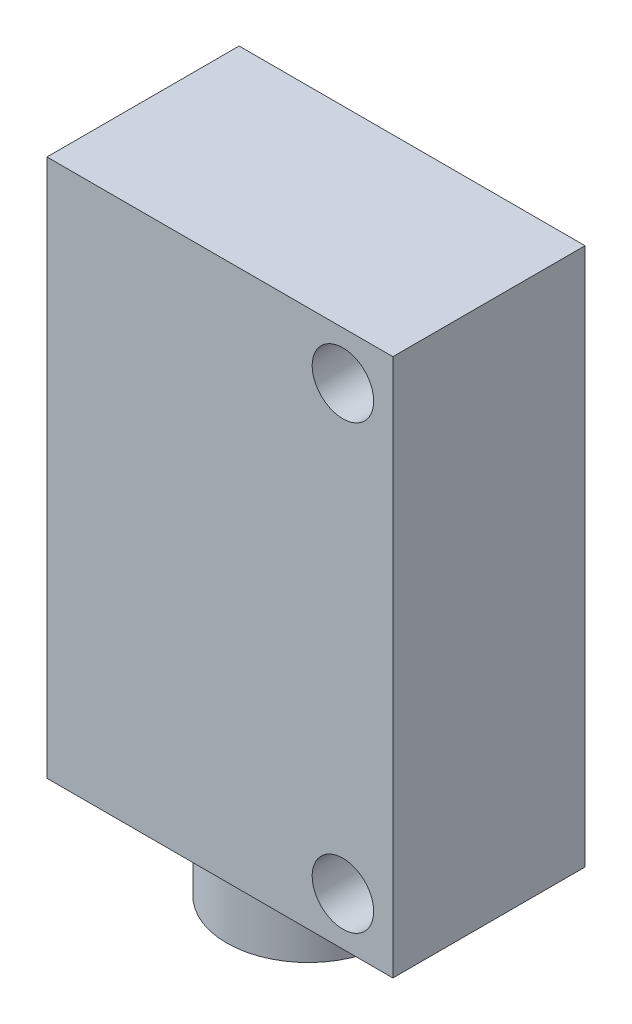
ISO-10303-21;
HEADER;
FILE_DESCRIPTION(('STEP AP214'),'2;1');
FILE_NAME('part.step','',(''),(''),'','','');
FILE_SCHEMA(('AUTOMOTIVE_DESIGN { 1 0 10303 214 1 1 1 1 }'));
ENDSEC;
DATA;
#1=APPLICATION_CONTEXT('core data for automotive mechanical design processes');
#2=APPLICATION_PROTOCOL_DEFINITION('international standard','automotive_design',2000,#1);
#3=PRODUCT_CONTEXT('',#1,'mechanical');
#4=PRODUCT('Part','Part','',(#3));
#5=PRODUCT_RELATED_PRODUCT_CATEGORY('part','',(#4));
#6=PRODUCT_DEFINITION_FORMATION('','',#4);
#7=PRODUCT_DEFINITION_CONTEXT('part definition',#1,'design');
#8=PRODUCT_DEFINITION('design','',#6,#7);
#9=PRODUCT_DEFINITION_SHAPE('','',#8);
#10=(LENGTH_UNIT() NAMED_UNIT(*) SI_UNIT(.MILLI.,.METRE.));
#11=(NAMED_UNIT(*) PLANE_ANGLE_UNIT() SI_UNIT($,.RADIAN.));
#12=(NAMED_UNIT(*) SI_UNIT($,.STERADIAN.) SOLID_ANGLE_UNIT());
#13=UNCERTAINTY_MEASURE_WITH_UNIT(LENGTH_MEASURE(1.E-05),#10,'distance_accuracy_value','');
#14=(GEOMETRIC_REPRESENTATION_CONTEXT(3) GLOBAL_UNCERTAINTY_ASSIGNED_CONTEXT((#13)) GLOBAL_UNIT_ASSIGNED_CONTEXT((#10,
#11,#12)) REPRESENTATION_CONTEXT('',''));
#15=CARTESIAN_POINT('',(0.,0.,0.));
#16=DIRECTION('',(0.,0.,1.));
#17=DIRECTION('',(1.,0.,0.));
#18=AXIS2_PLACEMENT_3D('',#15,#16,#17);
#19=CARTESIAN_POINT('',(0.,0.,10.));
#20=DIRECTION('',(1.,0.,0.));
#21=DIRECTION('',(0.,0.,-1.));
#22=AXIS2_PLACEMENT_3D('',#19,#20,#21);
#23=PLANE('',#22);
#24=DIRECTION('',(0.,-1.,0.));
#25=VECTOR('',#24,1.);
#26=CARTESIAN_POINT('',(0.,0.,0.));
#27=LINE('',#26,#25);
#28=CARTESIAN_POINT('',(0.,28.,0.));
#29=VERTEX_POINT('',#28);
#30=CARTESIAN_POINT('',(0.,0.,0.));
#31=VERTEX_POINT('',#30);
#32=EDGE_CURVE('E137',#29,#31,#27,.T.);
#33=ORIENTED_EDGE('',*,*,#32,.T.);
#34=DIRECTION('',(0.,0.,-1.));
#35=VECTOR('',#34,1.);
#36=CARTESIAN_POINT('',(0.,0.,10.));
#37=LINE('',#36,#35);
#38=CARTESIAN_POINT('',(0.,0.,10.));
#39=VERTEX_POINT('',#38);
#40=EDGE_CURVE('E39',#39,#31,#37,.T.);
#41=ORIENTED_EDGE('',*,*,#40,.F.);
#42=DIRECTION('',(0.,-1.,0.));
#43=VECTOR('',#42,1.);
#44=CARTESIAN_POINT('',(0.,0.,10.));
#45=LINE('',#44,#43);
#46=CARTESIAN_POINT('',(0.,28.,10.));
#47=VERTEX_POINT('',#46);
#48=EDGE_CURVE('E138',#47,#39,#45,.T.);
#49=ORIENTED_EDGE('',*,*,#48,.F.);
#50=DIRECTION('',(0.,0.,-1.));
#51=VECTOR('',#50,1.);
#52=CARTESIAN_POINT('',(0.,28.,10.));
#53=LINE('',#52,#51);
#54=EDGE_CURVE('E148',#47,#29,#53,.T.);
#55=ORIENTED_EDGE('',*,*,#54,.T.);
#56=EDGE_LOOP('',(#33,#41,#49,#55));
#57=FACE_BOUND('',#56,.T.);
#58=DIRECTION('',(0.,-1.,0.));
#59=VECTOR('',#58,1.);
#60=CARTESIAN_POINT('',(0.,25.6158389563872,1.73691712603841));
#61=LINE('',#60,#59);
#62=CARTESIAN_POINT('',(0.,25.6158389563872,1.73691712603841));
#63=VERTEX_POINT('',#62);
#64=CARTESIAN_POINT('',(0.,2.12586743571919,1.73691712603841));
#65=VERTEX_POINT('',#64);
#66=EDGE_CURVE('E116',#63,#65,#61,.T.);
#67=ORIENTED_EDGE('',*,*,#66,.F.);
#68=DIRECTION('',(0.,0.,-1.));
#69=VECTOR('',#68,1.);
#70=CARTESIAN_POINT('',(0.,25.6158389563872,1.73691712603841));
#71=LINE('',#70,#69);
#72=CARTESIAN_POINT('',(0.,25.6158389563872,8.61928643638521));
#73=VERTEX_POINT('',#72);
#74=EDGE_CURVE('E113',#73,#63,#71,.T.);
#75=ORIENTED_EDGE('',*,*,#74,.F.);
#76=DIRECTION('',(0.,1.,0.));
#77=VECTOR('',#76,1.);
#78=CARTESIAN_POINT('',(0.,25.6158389563872,8.61928643638521));
#79=LINE('',#78,#77);
#80=CARTESIAN_POINT('',(0.,2.12586743571919,8.61928643638521));
#81=VERTEX_POINT('',#80);
#82=EDGE_CURVE('E51',#81,#73,#79,.T.);
#83=ORIENTED_EDGE('',*,*,#82,.F.);
#84=DIRECTION('',(0.,0.,1.));
#85=VECTOR('',#84,1.);
#86=CARTESIAN_POINT('',(0.,2.12586743571919,1.73691712603841));
#87=LINE('',#86,#85);
#88=EDGE_CURVE('E46',#65,#81,#87,.T.);
#89=ORIENTED_EDGE('',*,*,#88,.F.);
#90=EDGE_LOOP('',(#67,#75,#83,#89));
#91=FACE_BOUND('',#90,.T.);
#92=ADVANCED_FACE('F32',(#57,#91),#23,.F.);
#93=CARTESIAN_POINT('',(0.,0.,10.));
#94=DIRECTION('',(0.,1.,0.));
#95=DIRECTION('',(0.,0.,1.));
#96=AXIS2_PLACEMENT_3D('',#93,#94,#95);
#97=PLANE('',#96);
#98=CARTESIAN_POINT('',(8.6,0.,5.));
#99=DIRECTION('',(0.,1.,0.));
#100=DIRECTION('',(0.,0.,1.));
#101=AXIS2_PLACEMENT_3D('',#98,#99,#100);
#102=CIRCLE('',#101,4.25);
#103=CARTESIAN_POINT('',(8.6,0.,9.25));
#104=VERTEX_POINT('',#103);
#105=EDGE_CURVE('E11',#104,#104,#102,.F.);
#106=ORIENTED_EDGE('',*,*,#105,.F.);
#107=EDGE_LOOP('',(#106));
#108=FACE_BOUND('',#107,.T.);
#109=DIRECTION('',(1.,0.,0.));
#110=VECTOR('',#109,1.);
#111=CARTESIAN_POINT('',(0.,0.,0.));
#112=LINE('',#111,#110);
#113=CARTESIAN_POINT('',(18.,0.,0.));
#114=VERTEX_POINT('',#113);
#115=EDGE_CURVE('E151',#31,#114,#112,.T.);
#116=ORIENTED_EDGE('',*,*,#115,.T.);
#117=DIRECTION('',(0.,0.,-1.));
#118=VECTOR('',#117,1.);
#119=CARTESIAN_POINT('',(18.,0.,10.));
#120=LINE('',#119,#118);
#121=CARTESIAN_POINT('',(18.,0.,10.));
#122=VERTEX_POINT('',#121);
#123=EDGE_CURVE('E161',#122,#114,#120,.T.);
#124=ORIENTED_EDGE('',*,*,#123,.F.);
#125=DIRECTION('',(1.,0.,0.));
#126=VECTOR('',#125,1.);
#127=CARTESIAN_POINT('',(0.,0.,10.));
#128=LINE('',#127,#126);
#129=EDGE_CURVE('E141',#39,#122,#128,.T.);
#130=ORIENTED_EDGE('',*,*,#129,.F.);
#131=ORIENTED_EDGE('',*,*,#40,.T.);
#132=EDGE_LOOP('',(#116,#124,#130,#131));
#133=FACE_BOUND('',#132,.T.);
#134=ADVANCED_FACE('F166',(#108,#133),#97,.F.);
#135=CARTESIAN_POINT('',(18.,0.,10.));
#136=DIRECTION('',(-1.,0.,0.));
#137=DIRECTION('',(0.,0.,1.));
#138=AXIS2_PLACEMENT_3D('',#135,#136,#137);
#139=PLANE('',#138);
#140=DIRECTION('',(0.,1.,0.));
#141=VECTOR('',#140,1.);
#142=CARTESIAN_POINT('',(18.,0.,0.));
#143=LINE('',#142,#141);
#144=CARTESIAN_POINT('',(18.,28.,0.));
#145=VERTEX_POINT('',#144);
#146=EDGE_CURVE('E153',#114,#145,#143,.T.);
#147=ORIENTED_EDGE('',*,*,#146,.T.);
#148=DIRECTION('',(0.,0.,-1.));
#149=VECTOR('',#148,1.);
#150=CARTESIAN_POINT('',(18.,28.,10.));
#151=LINE('',#150,#149);
#152=CARTESIAN_POINT('',(18.,28.,10.));
#153=VERTEX_POINT('',#152);
#154=EDGE_CURVE('E158',#153,#145,#151,.T.);
#155=ORIENTED_EDGE('',*,*,#154,.F.);
#156=DIRECTION('',(0.,1.,0.));
#157=VECTOR('',#156,1.);
#158=CARTESIAN_POINT('',(18.,0.,10.));
#159=LINE('',#158,#157);
#160=EDGE_CURVE('E144',#122,#153,#159,.T.);
#161=ORIENTED_EDGE('',*,*,#160,.F.);
#162=ORIENTED_EDGE('',*,*,#123,.T.);
#163=EDGE_LOOP('',(#147,#155,#161,#162));
#164=FACE_BOUND('',#163,.T.);
#165=ADVANCED_FACE('F178',(#164),#139,.F.);
#166=CARTESIAN_POINT('',(0.,28.,10.));
#167=DIRECTION('',(0.,-1.,0.));
#168=DIRECTION('',(0.,0.,-1.));
#169=AXIS2_PLACEMENT_3D('',#166,#167,#168);
#170=PLANE('',#169);
#171=DIRECTION('',(-1.,0.,0.));
#172=VECTOR('',#171,1.);
#173=CARTESIAN_POINT('',(0.,28.,0.));
#174=LINE('',#173,#172);
#175=EDGE_CURVE('E142',#145,#29,#174,.T.);
#176=ORIENTED_EDGE('',*,*,#175,.T.);
#177=ORIENTED_EDGE('',*,*,#54,.F.);
#178=DIRECTION('',(-1.,0.,0.));
#179=VECTOR('',#178,1.);
#180=CARTESIAN_POINT('',(0.,28.,10.));
#181=LINE('',#180,#179);
#182=EDGE_CURVE('E146',#153,#47,#181,.T.);
#183=ORIENTED_EDGE('',*,*,#182,.F.);
#184=ORIENTED_EDGE('',*,*,#154,.T.);
#185=EDGE_LOOP('',(#176,#177,#183,#184));
#186=FACE_BOUND('',#185,.T.);
#187=ADVANCED_FACE('F182',(#186),#170,.F.);
#188=CARTESIAN_POINT('',(0.,0.,10.));
#189=DIRECTION('',(0.,0.,-1.));
#190=DIRECTION('',(-1.,0.,0.));
#191=AXIS2_PLACEMENT_3D('',#188,#189,#190);
#192=PLANE('',#191);
#193=CARTESIAN_POINT('',(15.4,2.5,10.));
#194=DIRECTION('',(0.,0.,-1.));
#195=DIRECTION('',(-1.,0.,0.));
#196=AXIS2_PLACEMENT_3D('',#193,#194,#195);
#197=CIRCLE('',#196,1.6);
#198=CARTESIAN_POINT('',(13.8,2.5,10.));
#199=VERTEX_POINT('',#198);
#200=EDGE_CURVE('E120',#199,#199,#197,.T.);
#201=ORIENTED_EDGE('',*,*,#200,.T.);
#202=EDGE_LOOP('',(#201));
#203=FACE_BOUND('',#202,.T.);
#204=CARTESIAN_POINT('',(15.4,25.5,10.));
#205=DIRECTION('',(0.,0.,-1.));
#206=DIRECTION('',(-1.,0.,0.));
#207=AXIS2_PLACEMENT_3D('',#204,#205,#206);
#208=CIRCLE('',#207,1.6);
#209=CARTESIAN_POINT('',(13.8,25.5,10.));
#210=VERTEX_POINT('',#209);
#211=EDGE_CURVE('E131',#210,#210,#208,.T.);
#212=ORIENTED_EDGE('',*,*,#211,.T.);
#213=EDGE_LOOP('',(#212));
#214=FACE_BOUND('',#213,.T.);
#215=ORIENTED_EDGE('',*,*,#48,.T.);
#216=ORIENTED_EDGE('',*,*,#129,.T.);
#217=ORIENTED_EDGE('',*,*,#160,.T.);
#218=ORIENTED_EDGE('',*,*,#182,.T.);
#219=EDGE_LOOP('',(#215,#216,#217,#218));
#220=FACE_BOUND('',#219,.T.);
#221=ADVANCED_FACE('F184',(#203,#214,#220),#192,.F.);
#222=CARTESIAN_POINT('',(0.,0.,0.));
#223=DIRECTION('',(0.,0.,-1.));
#224=DIRECTION('',(-1.,0.,0.));
#225=AXIS2_PLACEMENT_3D('',#222,#223,#224);
#226=PLANE('',#225);
#227=CARTESIAN_POINT('',(15.4,2.5,0.));
#228=DIRECTION('',(0.,0.,-1.));
#229=DIRECTION('',(-1.,0.,0.));
#230=AXIS2_PLACEMENT_3D('',#227,#228,#229);
#231=CIRCLE('',#230,1.6);
#232=CARTESIAN_POINT('',(13.8,2.5,0.));
#233=VERTEX_POINT('',#232);
#234=EDGE_CURVE('E117',#233,#233,#231,.T.);
#235=ORIENTED_EDGE('',*,*,#234,.F.);
#236=EDGE_LOOP('',(#235));
#237=FACE_BOUND('',#236,.T.);
#238=CARTESIAN_POINT('',(15.4,25.5,0.));
#239=DIRECTION('',(0.,0.,-1.));
#240=DIRECTION('',(-1.,0.,0.));
#241=AXIS2_PLACEMENT_3D('',#238,#239,#240);
#242=CIRCLE('',#241,1.6);
#243=CARTESIAN_POINT('',(13.8,25.5,0.));
#244=VERTEX_POINT('',#243);
#245=EDGE_CURVE('E128',#244,#244,#242,.T.);
#246=ORIENTED_EDGE('',*,*,#245,.F.);
#247=EDGE_LOOP('',(#246));
#248=FACE_BOUND('',#247,.T.);
#249=ORIENTED_EDGE('',*,*,#32,.F.);
#250=ORIENTED_EDGE('',*,*,#175,.F.);
#251=ORIENTED_EDGE('',*,*,#146,.F.);
#252=ORIENTED_EDGE('',*,*,#115,.F.);
#253=EDGE_LOOP('',(#249,#250,#251,#252));
#254=FACE_BOUND('',#253,.T.);
#255=ADVANCED_FACE('F174',(#237,#248,#254),#226,.T.);
#256=CARTESIAN_POINT('',(8.6,-3.5,5.));
#257=DIRECTION('',(0.,1.,0.));
#258=DIRECTION('',(0.,0.,1.));
#259=AXIS2_PLACEMENT_3D('',#256,#257,#258);
#260=CYLINDRICAL_SURFACE('',#259,4.25);
#261=CARTESIAN_POINT('',(8.6,-3.5,5.));
#262=DIRECTION('',(0.,-1.,0.));
#263=DIRECTION('',(0.,0.,-1.));
#264=AXIS2_PLACEMENT_3D('',#261,#262,#263);
#265=CIRCLE('',#264,4.25);
#266=CARTESIAN_POINT('',(8.6,-3.5,0.75));
#267=VERTEX_POINT('',#266);
#268=EDGE_CURVE('E134',#267,#267,#265,.T.);
#269=ORIENTED_EDGE('',*,*,#268,.F.);
#270=EDGE_LOOP('',(#269));
#271=FACE_BOUND('',#270,.T.);
#272=ORIENTED_EDGE('',*,*,#105,.T.);
#273=EDGE_LOOP('',(#272));
#274=FACE_BOUND('',#273,.T.);
#275=ADVANCED_FACE('F192',(#271,#274),#260,.T.);
#276=CARTESIAN_POINT('',(8.6,-3.5,5.));
#277=DIRECTION('',(0.,-1.,0.));
#278=DIRECTION('',(0.,0.,-1.));
#279=AXIS2_PLACEMENT_3D('',#276,#277,#278);
#280=PLANE('',#279);
#281=ORIENTED_EDGE('',*,*,#268,.T.);
#282=EDGE_LOOP('',(#281));
#283=FACE_BOUND('',#282,.T.);
#284=ADVANCED_FACE('F210',(#283),#280,.T.);
#285=CARTESIAN_POINT('',(15.4,25.5,10.2));
#286=DIRECTION('',(0.,0.,-1.));
#287=DIRECTION('',(-1.,0.,0.));
#288=AXIS2_PLACEMENT_3D('',#285,#286,#287);
#289=CYLINDRICAL_SURFACE('',#288,1.6);
#290=ORIENTED_EDGE('',*,*,#245,.T.);
#291=EDGE_LOOP('',(#290));
#292=FACE_BOUND('',#291,.T.);
#293=ORIENTED_EDGE('',*,*,#211,.F.);
#294=EDGE_LOOP('',(#293));
#295=FACE_BOUND('',#294,.T.);
#296=ADVANCED_FACE('F215',(#292,#295),#289,.F.);
#297=CARTESIAN_POINT('',(15.4,2.5,10.2));
#298=DIRECTION('',(0.,0.,-1.));
#299=DIRECTION('',(-1.,0.,0.));
#300=AXIS2_PLACEMENT_3D('',#297,#298,#299);
#301=CYLINDRICAL_SURFACE('',#300,1.6);
#302=ORIENTED_EDGE('',*,*,#234,.T.);
#303=EDGE_LOOP('',(#302));
#304=FACE_BOUND('',#303,.T.);
#305=ORIENTED_EDGE('',*,*,#200,.F.);
#306=EDGE_LOOP('',(#305));
#307=FACE_BOUND('',#306,.T.);
#308=ADVANCED_FACE('F222',(#304,#307),#301,.F.);
#309=CARTESIAN_POINT('',(-1.,25.6158389563872,1.73691712603841));
#310=DIRECTION('',(0.,0.,1.));
#311=DIRECTION('',(1.,0.,0.));
#312=AXIS2_PLACEMENT_3D('',#309,#310,#311);
#313=PLANE('',#312);
#314=ORIENTED_EDGE('',*,*,#66,.T.);
#315=DIRECTION('',(1.,0.,0.));
#316=VECTOR('',#315,1.);
#317=CARTESIAN_POINT('',(-1.,2.12586743571919,1.73691712603841));
#318=LINE('',#317,#316);
#319=CARTESIAN_POINT('',(-1.,2.12586743571919,1.73691712603841));
#320=VERTEX_POINT('',#319);
#321=EDGE_CURVE('E97',#320,#65,#318,.T.);
#322=ORIENTED_EDGE('',*,*,#321,.F.);
#323=DIRECTION('',(0.,-1.,0.));
#324=VECTOR('',#323,1.);
#325=CARTESIAN_POINT('',(-1.,25.6158389563872,1.73691712603841));
#326=LINE('',#325,#324);
#327=CARTESIAN_POINT('',(-1.,25.6158389563872,1.73691712603841));
#328=VERTEX_POINT('',#327);
#329=EDGE_CURVE('E104',#328,#320,#326,.T.);
#330=ORIENTED_EDGE('',*,*,#329,.F.);
#331=DIRECTION('',(1.,0.,0.));
#332=VECTOR('',#331,1.);
#333=CARTESIAN_POINT('',(-1.,25.6158389563872,1.73691712603841));
#334=LINE('',#333,#332);
#335=EDGE_CURVE('E324',#328,#63,#334,.T.);
#336=ORIENTED_EDGE('',*,*,#335,.T.);
#337=EDGE_LOOP('',(#314,#322,#330,#336));
#338=FACE_BOUND('',#337,.T.);
#339=ADVANCED_FACE('F115',(#338),#313,.F.);
#340=CARTESIAN_POINT('',(-1.,2.12586743571919,1.73691712603841));
#341=DIRECTION('',(0.,1.,0.));
#342=DIRECTION('',(0.,0.,1.));
#343=AXIS2_PLACEMENT_3D('',#340,#341,#342);
#344=PLANE('',#343);
#345=ORIENTED_EDGE('',*,*,#88,.T.);
#346=DIRECTION('',(1.,0.,0.));
#347=VECTOR('',#346,1.);
#348=CARTESIAN_POINT('',(-1.,2.12586743571919,8.61928643638521));
#349=LINE('',#348,#347);
#350=CARTESIAN_POINT('',(-1.,2.12586743571919,8.61928643638521));
#351=VERTEX_POINT('',#350);
#352=EDGE_CURVE('E100',#351,#81,#349,.T.);
#353=ORIENTED_EDGE('',*,*,#352,.F.);
#354=DIRECTION('',(0.,0.,1.));
#355=VECTOR('',#354,1.);
#356=CARTESIAN_POINT('',(-1.,2.12586743571919,1.73691712603841));
#357=LINE('',#356,#355);
#358=EDGE_CURVE('E93',#320,#351,#357,.T.);
#359=ORIENTED_EDGE('',*,*,#358,.F.);
#360=ORIENTED_EDGE('',*,*,#321,.T.);
#361=EDGE_LOOP('',(#345,#353,#359,#360));
#362=FACE_BOUND('',#361,.T.);
#363=ADVANCED_FACE('F95',(#362),#344,.F.);
#364=CARTESIAN_POINT('',(-1.,25.6158389563872,8.61928643638521));
#365=DIRECTION('',(0.,0.,-1.));
#366=DIRECTION('',(-1.,0.,0.));
#367=AXIS2_PLACEMENT_3D('',#364,#365,#366);
#368=PLANE('',#367);
#369=ORIENTED_EDGE('',*,*,#82,.T.);
#370=DIRECTION('',(1.,0.,0.));
#371=VECTOR('',#370,1.);
#372=CARTESIAN_POINT('',(-1.,25.6158389563872,8.61928643638521));
#373=LINE('',#372,#371);
#374=CARTESIAN_POINT('',(-1.,25.6158389563872,8.61928643638521));
#375=VERTEX_POINT('',#374);
#376=EDGE_CURVE('E122',#375,#73,#373,.T.);
#377=ORIENTED_EDGE('',*,*,#376,.F.);
#378=DIRECTION('',(0.,1.,0.));
#379=VECTOR('',#378,1.);
#380=CARTESIAN_POINT('',(-1.,25.6158389563872,8.61928643638521));
#381=LINE('',#380,#379);
#382=EDGE_CURVE('E103',#351,#375,#381,.T.);
#383=ORIENTED_EDGE('',*,*,#382,.F.);
#384=ORIENTED_EDGE('',*,*,#352,.T.);
#385=EDGE_LOOP('',(#369,#377,#383,#384));
#386=FACE_BOUND('',#385,.T.);
#387=ADVANCED_FACE('F231',(#386),#368,.F.);
#388=CARTESIAN_POINT('',(-1.,25.6158389563872,1.73691712603841));
#389=DIRECTION('',(0.,-1.,0.));
#390=DIRECTION('',(0.,0.,-1.));
#391=AXIS2_PLACEMENT_3D('',#388,#389,#390);
#392=PLANE('',#391);
#393=ORIENTED_EDGE('',*,*,#74,.T.);
#394=ORIENTED_EDGE('',*,*,#335,.F.);
#395=DIRECTION('',(0.,0.,-1.));
#396=VECTOR('',#395,1.);
#397=CARTESIAN_POINT('',(-1.,25.6158389563872,1.73691712603841));
#398=LINE('',#397,#396);
#399=EDGE_CURVE('E109',#375,#328,#398,.T.);
#400=ORIENTED_EDGE('',*,*,#399,.F.);
#401=ORIENTED_EDGE('',*,*,#376,.T.);
#402=EDGE_LOOP('',(#393,#394,#400,#401));
#403=FACE_BOUND('',#402,.T.);
#404=ADVANCED_FACE('F234',(#403),#392,.F.);
#405=CARTESIAN_POINT('',(-1.,0.,0.));
#406=DIRECTION('',(-1.,0.,0.));
#407=DIRECTION('',(0.,0.,1.));
#408=AXIS2_PLACEMENT_3D('',#405,#406,#407);
#409=PLANE('',#408);
#410=ORIENTED_EDGE('',*,*,#329,.T.);
#411=ORIENTED_EDGE('',*,*,#358,.T.);
#412=ORIENTED_EDGE('',*,*,#382,.T.);
#413=ORIENTED_EDGE('',*,*,#399,.T.);
#414=EDGE_LOOP('',(#410,#411,#412,#413));
#415=FACE_BOUND('',#414,.T.);
#416=ADVANCED_FACE('F107',(#415),#409,.T.);
#417=CLOSED_SHELL('',(#92,#134,#165,#187,#221,#255,#275,#284,#296,#308,#339,#363,#387,#404,#416));
#418=MANIFOLD_SOLID_BREP('B2',#417);
#419=ADVANCED_BREP_SHAPE_REPRESENTATION('',(#18,#418),#14);
#420=SHAPE_DEFINITION_REPRESENTATION(#9,#419);
ENDSEC;
END-ISO-10303-21;
